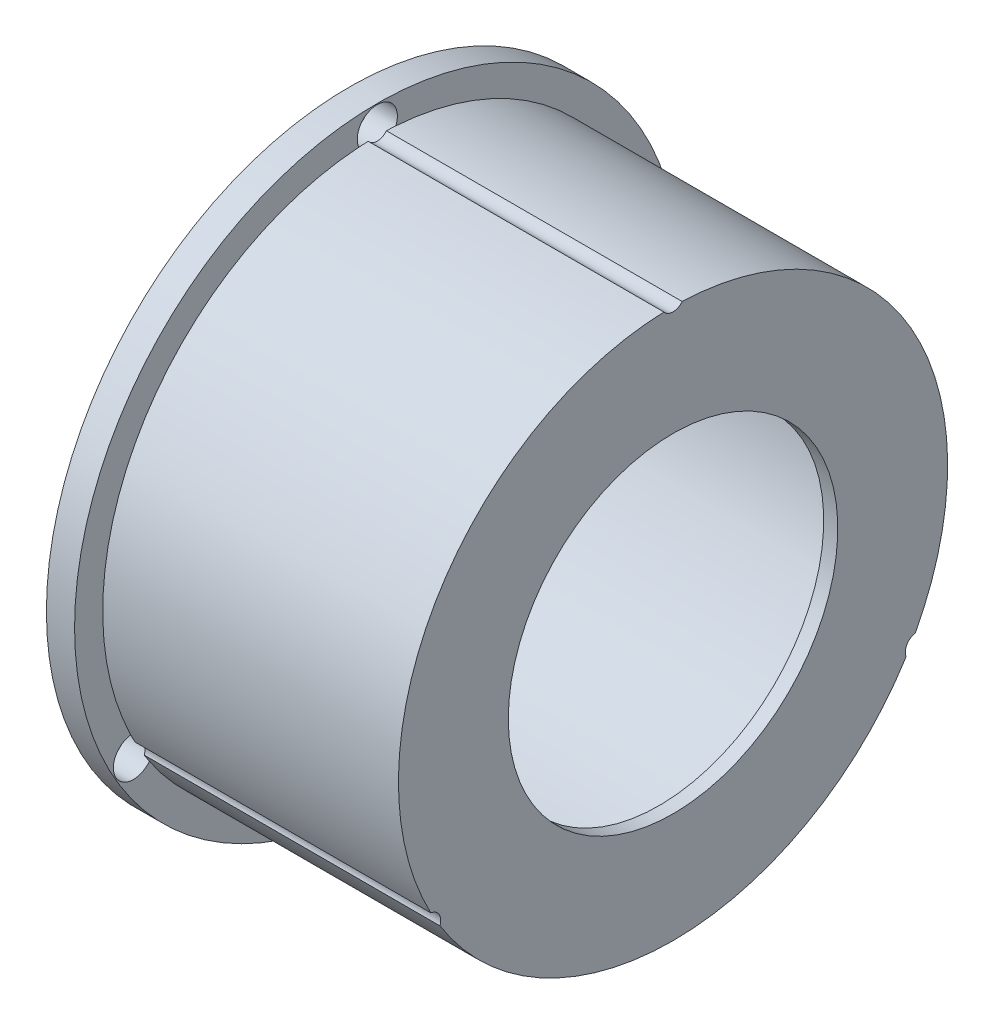
ISO-10303-21;
HEADER;
FILE_DESCRIPTION(('STEP AP214'),'2;1');
FILE_NAME('part.step','',(''),(''),'','','');
FILE_SCHEMA(('AUTOMOTIVE_DESIGN { 1 0 10303 214 1 1 1 1 }'));
ENDSEC;
DATA;
#1=APPLICATION_CONTEXT('core data for automotive mechanical design processes');
#2=APPLICATION_PROTOCOL_DEFINITION('international standard','automotive_design',2000,#1);
#3=PRODUCT_CONTEXT('',#1,'mechanical');
#4=PRODUCT('Part','Part','',(#3));
#5=PRODUCT_RELATED_PRODUCT_CATEGORY('part','',(#4));
#6=PRODUCT_DEFINITION_FORMATION('','',#4);
#7=PRODUCT_DEFINITION_CONTEXT('part definition',#1,'design');
#8=PRODUCT_DEFINITION('design','',#6,#7);
#9=PRODUCT_DEFINITION_SHAPE('','',#8);
#10=(LENGTH_UNIT() NAMED_UNIT(*) SI_UNIT(.MILLI.,.METRE.));
#11=(NAMED_UNIT(*) PLANE_ANGLE_UNIT() SI_UNIT($,.RADIAN.));
#12=(NAMED_UNIT(*) SI_UNIT($,.STERADIAN.) SOLID_ANGLE_UNIT());
#13=UNCERTAINTY_MEASURE_WITH_UNIT(LENGTH_MEASURE(1.E-05),#10,'distance_accuracy_value','');
#14=(GEOMETRIC_REPRESENTATION_CONTEXT(3) GLOBAL_UNCERTAINTY_ASSIGNED_CONTEXT((#13)) GLOBAL_UNIT_ASSIGNED_CONTEXT((#10,
#11,#12)) REPRESENTATION_CONTEXT('',''));
#15=CARTESIAN_POINT('',(0.,0.,0.));
#16=DIRECTION('',(0.,0.,1.));
#17=DIRECTION('',(1.,0.,0.));
#18=AXIS2_PLACEMENT_3D('',#15,#16,#17);
#19=CARTESIAN_POINT('',(-110.,0.,0.));
#20=DIRECTION('',(-1.,0.,0.));
#21=DIRECTION('',(0.,0.,1.));
#22=AXIS2_PLACEMENT_3D('',#19,#20,#21);
#23=CYLINDRICAL_SURFACE('',#22,39.);
#24=DIRECTION('',(-1.,0.,0.));
#25=VECTOR('',#24,1.);
#26=CARTESIAN_POINT('',(90.85,38.9784687500001,-1.29575225458943));
#27=LINE('',#26,#25);
#28=CARTESIAN_POINT('',(181.7,38.97846875,-1.29575225458937));
#29=VERTEX_POINT('',#28);
#30=CARTESIAN_POINT('',(139.7,38.97846875,-1.2957522545894));
#31=VERTEX_POINT('',#30);
#32=EDGE_CURVE('E215',#29,#31,#27,.T.);
#33=ORIENTED_EDGE('',*,*,#32,.F.);
#34=CARTESIAN_POINT('',(181.7,0.,0.));
#35=DIRECTION('',(-1.,0.,0.));
#36=DIRECTION('',(0.,0.,1.));
#37=AXIS2_PLACEMENT_3D('',#34,#35,#36);
#38=CIRCLE('',#37,39.);
#39=CARTESIAN_POINT('',(181.7,-18.3670800055147,-34.4042202654125));
#40=VERTEX_POINT('',#39);
#41=EDGE_CURVE('E166',#29,#40,#38,.T.);
#42=ORIENTED_EDGE('',*,*,#41,.T.);
#43=DIRECTION('',(-1.,0.,0.));
#44=VECTOR('',#43,1.);
#45=CARTESIAN_POINT('',(90.85,-18.3670800055146,-34.4042202654126));
#46=LINE('',#45,#44);
#47=CARTESIAN_POINT('',(139.7,-18.3670800055145,-34.4042202654126));
#48=VERTEX_POINT('',#47);
#49=EDGE_CURVE('E264',#48,#40,#46,.F.);
#50=ORIENTED_EDGE('',*,*,#49,.F.);
#51=CARTESIAN_POINT('',(139.7,0.,0.));
#52=DIRECTION('',(1.,0.,0.));
#53=DIRECTION('',(0.,0.,-1.));
#54=AXIS2_PLACEMENT_3D('',#51,#52,#53);
#55=CIRCLE('',#54,39.);
#56=CARTESIAN_POINT('',(139.7,-17.1746110329679,-35.0147502613721));
#57=VERTEX_POINT('',#56);
#58=EDGE_CURVE('E266',#48,#57,#55,.T.);
#59=ORIENTED_EDGE('',*,*,#58,.T.);
#60=CARTESIAN_POINT('',(139.7,0.,0.));
#61=DIRECTION('',(-1.,0.,0.));
#62=DIRECTION('',(0.,0.,1.));
#63=AXIS2_PLACEMENT_3D('',#60,#61,#62);
#64=CIRCLE('',#63,39.);
#65=CARTESIAN_POINT('',(139.7,38.91096875,-2.63372567601933));
#66=VERTEX_POINT('',#65);
#67=EDGE_CURVE('E157',#66,#57,#64,.T.);
#68=ORIENTED_EDGE('',*,*,#67,.F.);
#69=EDGE_CURVE('E125',#31,#66,#64,.T.);
#70=ORIENTED_EDGE('',*,*,#69,.F.);
#71=EDGE_LOOP('',(#33,#42,#50,#59,#68,#70));
#72=FACE_BOUND('',#71,.T.);
#73=ADVANCED_FACE('F39',(#72),#23,.T.);
#74=DIRECTION('',(-1.,0.,0.));
#75=VECTOR('',#74,1.);
#76=CARTESIAN_POINT('',(90.85,38.9784687500001,1.29575225458943));
#77=LINE('',#76,#75);
#78=CARTESIAN_POINT('',(139.7,38.97846875,1.29575225458954));
#79=VERTEX_POINT('',#78);
#80=CARTESIAN_POINT('',(181.7,38.97846875,1.29575225458937));
#81=VERTEX_POINT('',#80);
#82=EDGE_CURVE('E134',#79,#81,#77,.F.);
#83=ORIENTED_EDGE('',*,*,#82,.F.);
#84=CARTESIAN_POINT('',(139.7,0.,0.));
#85=DIRECTION('',(1.,0.,0.));
#86=DIRECTION('',(0.,0.,-1.));
#87=AXIS2_PLACEMENT_3D('',#84,#85,#86);
#88=CIRCLE('',#87,39.);
#89=CARTESIAN_POINT('',(139.7,38.91096875,2.63372567601933));
#90=VERTEX_POINT('',#89);
#91=EDGE_CURVE('E55',#79,#90,#88,.T.);
#92=ORIENTED_EDGE('',*,*,#91,.T.);
#93=CARTESIAN_POINT('',(139.7,-17.1746110329679,35.0147502613721));
#94=VERTEX_POINT('',#93);
#95=EDGE_CURVE('E132',#94,#90,#64,.T.);
#96=ORIENTED_EDGE('',*,*,#95,.F.);
#97=CARTESIAN_POINT('',(139.7,-18.3670800055146,34.4042202654126));
#98=VERTEX_POINT('',#97);
#99=EDGE_CURVE('E145',#98,#94,#64,.T.);
#100=ORIENTED_EDGE('',*,*,#99,.F.);
#101=DIRECTION('',(-1.,0.,0.));
#102=VECTOR('',#101,1.);
#103=CARTESIAN_POINT('',(90.85,-18.3670800055146,34.4042202654127));
#104=LINE('',#103,#102);
#105=CARTESIAN_POINT('',(181.7,-18.3670800055146,34.4042202654126));
#106=VERTEX_POINT('',#105);
#107=EDGE_CURVE('E206',#106,#98,#104,.T.);
#108=ORIENTED_EDGE('',*,*,#107,.F.);
#109=EDGE_CURVE('E163',#106,#81,#38,.T.);
#110=ORIENTED_EDGE('',*,*,#109,.T.);
#111=EDGE_LOOP('',(#83,#92,#96,#100,#108,#110));
#112=FACE_BOUND('',#111,.T.);
#113=ADVANCED_FACE('F130',(#112),#23,.T.);
#114=DIRECTION('',(-1.,0.,0.));
#115=VECTOR('',#114,1.);
#116=CARTESIAN_POINT('',(90.85,-20.6113887444854,33.1084680108232));
#117=LINE('',#116,#115);
#118=CARTESIAN_POINT('',(139.7,-20.6113887444855,33.1084680108231));
#119=VERTEX_POINT('',#118);
#120=CARTESIAN_POINT('',(181.7,-20.6113887444853,33.1084680108232));
#121=VERTEX_POINT('',#120);
#122=EDGE_CURVE('E211',#119,#121,#117,.F.);
#123=ORIENTED_EDGE('',*,*,#122,.F.);
#124=CARTESIAN_POINT('',(139.7,0.,0.));
#125=DIRECTION('',(1.,0.,0.));
#126=DIRECTION('',(0.,0.,-1.));
#127=AXIS2_PLACEMENT_3D('',#124,#125,#126);
#128=CIRCLE('',#127,39.);
#129=CARTESIAN_POINT('',(139.7,-21.7363577170321,32.3810245853528));
#130=VERTEX_POINT('',#129);
#131=EDGE_CURVE('E136',#119,#130,#128,.T.);
#132=ORIENTED_EDGE('',*,*,#131,.T.);
#133=CARTESIAN_POINT('',(139.7,-21.7363577170321,-32.3810245853528));
#134=VERTEX_POINT('',#133);
#135=EDGE_CURVE('E148',#134,#130,#64,.T.);
#136=ORIENTED_EDGE('',*,*,#135,.F.);
#137=CARTESIAN_POINT('',(139.7,-20.6113887444854,-33.1084680108232));
#138=VERTEX_POINT('',#137);
#139=EDGE_CURVE('E156',#138,#134,#64,.T.);
#140=ORIENTED_EDGE('',*,*,#139,.F.);
#141=DIRECTION('',(-1.,0.,0.));
#142=VECTOR('',#141,1.);
#143=CARTESIAN_POINT('',(90.85,-20.6113887444855,-33.1084680108232));
#144=LINE('',#143,#142);
#145=CARTESIAN_POINT('',(181.7,-20.6113887444854,-33.1084680108232));
#146=VERTEX_POINT('',#145);
#147=EDGE_CURVE('E217',#146,#138,#144,.T.);
#148=ORIENTED_EDGE('',*,*,#147,.F.);
#149=EDGE_CURVE('E165',#146,#121,#38,.T.);
#150=ORIENTED_EDGE('',*,*,#149,.T.);
#151=EDGE_LOOP('',(#123,#132,#136,#140,#148,#150));
#152=FACE_BOUND('',#151,.T.);
#153=ADVANCED_FACE('F245',(#152),#23,.T.);
#154=CARTESIAN_POINT('',(135.7,43.,0.));
#155=DIRECTION('',(1.,0.,0.));
#156=DIRECTION('',(0.,0.,-1.));
#157=AXIS2_PLACEMENT_3D('',#154,#155,#156);
#158=PLANE('',#157);
#159=CARTESIAN_POINT('',(135.7,40.,0.));
#160=DIRECTION('',(1.,0.,0.));
#161=DIRECTION('',(0.,0.,-1.));
#162=AXIS2_PLACEMENT_3D('',#159,#160,#161);
#163=CIRCLE('',#162,2.85);
#164=CARTESIAN_POINT('',(135.7,40.,-2.85));
#165=VERTEX_POINT('',#164);
#166=EDGE_CURVE('E121',#165,#165,#163,.T.);
#167=ORIENTED_EDGE('',*,*,#166,.T.);
#168=EDGE_LOOP('',(#167));
#169=FACE_BOUND('',#168,.T.);
#170=CARTESIAN_POINT('',(135.7,-20.,34.6410161513775));
#171=DIRECTION('',(1.,0.,0.));
#172=DIRECTION('',(0.,0.,-1.));
#173=AXIS2_PLACEMENT_3D('',#170,#171,#172);
#174=CIRCLE('',#173,2.85);
#175=CARTESIAN_POINT('',(135.7,-20.,31.7910161513775));
#176=VERTEX_POINT('',#175);
#177=EDGE_CURVE('E287',#176,#176,#174,.T.);
#178=ORIENTED_EDGE('',*,*,#177,.T.);
#179=EDGE_LOOP('',(#178));
#180=FACE_BOUND('',#179,.T.);
#181=CARTESIAN_POINT('',(135.7,-20.,-34.6410161513775));
#182=DIRECTION('',(1.,0.,0.));
#183=DIRECTION('',(0.,0.,-1.));
#184=AXIS2_PLACEMENT_3D('',#181,#182,#183);
#185=CIRCLE('',#184,2.85);
#186=CARTESIAN_POINT('',(135.7,-20.,-37.4910161513775));
#187=VERTEX_POINT('',#186);
#188=EDGE_CURVE('E290',#187,#187,#185,.T.);
#189=ORIENTED_EDGE('',*,*,#188,.T.);
#190=EDGE_LOOP('',(#189));
#191=FACE_BOUND('',#190,.T.);
#192=CARTESIAN_POINT('',(135.7,0.,0.));
#193=DIRECTION('',(-1.,0.,0.));
#194=DIRECTION('',(0.,0.,1.));
#195=AXIS2_PLACEMENT_3D('',#192,#193,#194);
#196=CIRCLE('',#195,36.4);
#197=CARTESIAN_POINT('',(135.7,0.,36.4));
#198=VERTEX_POINT('',#197);
#199=EDGE_CURVE('E191',#198,#198,#196,.T.);
#200=ORIENTED_EDGE('',*,*,#199,.F.);
#201=EDGE_LOOP('',(#200));
#202=FACE_BOUND('',#201,.T.);
#203=CARTESIAN_POINT('',(135.7,0.,0.));
#204=DIRECTION('',(-1.,0.,0.));
#205=DIRECTION('',(0.,0.,1.));
#206=AXIS2_PLACEMENT_3D('',#203,#204,#205);
#207=CIRCLE('',#206,43.);
#208=CARTESIAN_POINT('',(135.7,0.,43.));
#209=VERTEX_POINT('',#208);
#210=EDGE_CURVE('E152',#209,#209,#207,.T.);
#211=ORIENTED_EDGE('',*,*,#210,.T.);
#212=EDGE_LOOP('',(#211));
#213=FACE_BOUND('',#212,.T.);
#214=ADVANCED_FACE('F41',(#169,#180,#191,#202,#213),#158,.F.);
#215=CARTESIAN_POINT('',(-110.,0.,0.));
#216=DIRECTION('',(-1.,0.,0.));
#217=DIRECTION('',(0.,0.,1.));
#218=AXIS2_PLACEMENT_3D('',#215,#216,#217);
#219=CYLINDRICAL_SURFACE('',#218,36.4);
#220=CARTESIAN_POINT('',(179.7,0.,0.));
#221=DIRECTION('',(-1.,0.,0.));
#222=DIRECTION('',(0.,0.,1.));
#223=AXIS2_PLACEMENT_3D('',#220,#221,#222);
#224=CIRCLE('',#223,36.4);
#225=CARTESIAN_POINT('',(179.7,0.,36.4));
#226=VERTEX_POINT('',#225);
#227=EDGE_CURVE('E185',#226,#226,#224,.T.);
#228=ORIENTED_EDGE('',*,*,#227,.F.);
#229=EDGE_LOOP('',(#228));
#230=FACE_BOUND('',#229,.T.);
#231=ORIENTED_EDGE('',*,*,#199,.T.);
#232=EDGE_LOOP('',(#231));
#233=FACE_BOUND('',#232,.T.);
#234=ADVANCED_FACE('F254',(#230,#233),#219,.F.);
#235=CARTESIAN_POINT('',(179.7,36.4,0.));
#236=DIRECTION('',(1.,0.,0.));
#237=DIRECTION('',(0.,0.,-1.));
#238=AXIS2_PLACEMENT_3D('',#235,#236,#237);
#239=PLANE('',#238);
#240=CARTESIAN_POINT('',(179.7,0.,0.));
#241=DIRECTION('',(-1.,0.,0.));
#242=DIRECTION('',(0.,0.,1.));
#243=AXIS2_PLACEMENT_3D('',#240,#241,#242);
#244=CIRCLE('',#243,23.4);
#245=CARTESIAN_POINT('',(179.7,0.,23.4));
#246=VERTEX_POINT('',#245);
#247=EDGE_CURVE('E180',#246,#246,#244,.T.);
#248=ORIENTED_EDGE('',*,*,#247,.F.);
#249=EDGE_LOOP('',(#248));
#250=FACE_BOUND('',#249,.T.);
#251=ORIENTED_EDGE('',*,*,#227,.T.);
#252=EDGE_LOOP('',(#251));
#253=FACE_BOUND('',#252,.T.);
#254=ADVANCED_FACE('F392',(#250,#253),#239,.F.);
#255=CARTESIAN_POINT('',(-110.,0.,0.));
#256=DIRECTION('',(-1.,0.,0.));
#257=DIRECTION('',(0.,0.,1.));
#258=AXIS2_PLACEMENT_3D('',#255,#256,#257);
#259=CYLINDRICAL_SURFACE('',#258,23.4);
#260=CARTESIAN_POINT('',(181.7,0.,0.));
#261=DIRECTION('',(-1.,0.,0.));
#262=DIRECTION('',(0.,0.,1.));
#263=AXIS2_PLACEMENT_3D('',#260,#261,#262);
#264=CIRCLE('',#263,23.4);
#265=CARTESIAN_POINT('',(181.7,0.,23.4));
#266=VERTEX_POINT('',#265);
#267=EDGE_CURVE('E174',#266,#266,#264,.T.);
#268=ORIENTED_EDGE('',*,*,#267,.F.);
#269=EDGE_LOOP('',(#268));
#270=FACE_BOUND('',#269,.T.);
#271=ORIENTED_EDGE('',*,*,#247,.T.);
#272=EDGE_LOOP('',(#271));
#273=FACE_BOUND('',#272,.T.);
#274=ADVANCED_FACE('F240',(#270,#273),#259,.F.);
#275=CARTESIAN_POINT('',(181.7,23.4,0.));
#276=DIRECTION('',(-1.,0.,0.));
#277=DIRECTION('',(0.,0.,1.));
#278=AXIS2_PLACEMENT_3D('',#275,#276,#277);
#279=PLANE('',#278);
#280=CARTESIAN_POINT('',(181.7,40.,0.));
#281=DIRECTION('',(1.,0.,0.));
#282=DIRECTION('',(0.,0.,-1.));
#283=AXIS2_PLACEMENT_3D('',#280,#281,#282);
#284=CIRCLE('',#283,1.65);
#285=EDGE_CURVE('E63',#81,#29,#284,.T.);
#286=ORIENTED_EDGE('',*,*,#285,.F.);
#287=ORIENTED_EDGE('',*,*,#109,.F.);
#288=CARTESIAN_POINT('',(181.7,-20.,34.6410161513775));
#289=DIRECTION('',(1.,0.,0.));
#290=DIRECTION('',(0.,0.,-1.));
#291=AXIS2_PLACEMENT_3D('',#288,#289,#290);
#292=CIRCLE('',#291,1.65);
#293=EDGE_CURVE('E209',#121,#106,#292,.T.);
#294=ORIENTED_EDGE('',*,*,#293,.F.);
#295=ORIENTED_EDGE('',*,*,#149,.F.);
#296=CARTESIAN_POINT('',(181.7,-20.,-34.6410161513775));
#297=DIRECTION('',(1.,0.,0.));
#298=DIRECTION('',(0.,0.,-1.));
#299=AXIS2_PLACEMENT_3D('',#296,#297,#298);
#300=CIRCLE('',#299,1.65);
#301=EDGE_CURVE('E260',#40,#146,#300,.T.);
#302=ORIENTED_EDGE('',*,*,#301,.F.);
#303=ORIENTED_EDGE('',*,*,#41,.F.);
#304=EDGE_LOOP('',(#286,#287,#294,#295,#302,#303));
#305=FACE_BOUND('',#304,.T.);
#306=ORIENTED_EDGE('',*,*,#267,.T.);
#307=EDGE_LOOP('',(#306));
#308=FACE_BOUND('',#307,.T.);
#309=ADVANCED_FACE('F235',(#305,#308),#279,.F.);
#310=CARTESIAN_POINT('',(139.7,39.,0.));
#311=DIRECTION('',(-1.,0.,0.));
#312=DIRECTION('',(0.,0.,1.));
#313=AXIS2_PLACEMENT_3D('',#310,#311,#312);
#314=PLANE('',#313);
#315=CARTESIAN_POINT('',(139.7,40.,0.));
#316=DIRECTION('',(1.,0.,0.));
#317=DIRECTION('',(0.,0.,-1.));
#318=AXIS2_PLACEMENT_3D('',#315,#316,#317);
#319=CIRCLE('',#318,2.85);
#320=EDGE_CURVE('E112',#66,#90,#319,.T.);
#321=ORIENTED_EDGE('',*,*,#320,.F.);
#322=ORIENTED_EDGE('',*,*,#67,.T.);
#323=CARTESIAN_POINT('',(139.7,-20.,-34.6410161513775));
#324=DIRECTION('',(1.,0.,0.));
#325=DIRECTION('',(0.,0.,-1.));
#326=AXIS2_PLACEMENT_3D('',#323,#324,#325);
#327=CIRCLE('',#326,2.85);
#328=EDGE_CURVE('E285',#134,#57,#327,.T.);
#329=ORIENTED_EDGE('',*,*,#328,.F.);
#330=ORIENTED_EDGE('',*,*,#135,.T.);
#331=CARTESIAN_POINT('',(139.7,-20.,34.6410161513775));
#332=DIRECTION('',(1.,0.,0.));
#333=DIRECTION('',(0.,0.,-1.));
#334=AXIS2_PLACEMENT_3D('',#331,#332,#333);
#335=CIRCLE('',#334,2.85);
#336=EDGE_CURVE('E143',#94,#130,#335,.T.);
#337=ORIENTED_EDGE('',*,*,#336,.F.);
#338=ORIENTED_EDGE('',*,*,#95,.T.);
#339=EDGE_LOOP('',(#321,#322,#329,#330,#337,#338));
#340=FACE_BOUND('',#339,.T.);
#341=CARTESIAN_POINT('',(139.7,0.,0.));
#342=DIRECTION('',(-1.,0.,0.));
#343=DIRECTION('',(0.,0.,1.));
#344=AXIS2_PLACEMENT_3D('',#341,#342,#343);
#345=CIRCLE('',#344,43.);
#346=CARTESIAN_POINT('',(139.7,0.,43.));
#347=VERTEX_POINT('',#346);
#348=EDGE_CURVE('E146',#347,#347,#345,.T.);
#349=ORIENTED_EDGE('',*,*,#348,.F.);
#350=EDGE_LOOP('',(#349));
#351=FACE_BOUND('',#350,.T.);
#352=ADVANCED_FACE('F139',(#340,#351),#314,.F.);
#353=CARTESIAN_POINT('',(-110.,0.,0.));
#354=DIRECTION('',(-1.,0.,0.));
#355=DIRECTION('',(0.,0.,1.));
#356=AXIS2_PLACEMENT_3D('',#353,#354,#355);
#357=CYLINDRICAL_SURFACE('',#356,43.);
#358=ORIENTED_EDGE('',*,*,#210,.F.);
#359=EDGE_LOOP('',(#358));
#360=FACE_BOUND('',#359,.T.);
#361=ORIENTED_EDGE('',*,*,#348,.T.);
#362=EDGE_LOOP('',(#361));
#363=FACE_BOUND('',#362,.T.);
#364=ADVANCED_FACE('F228',(#360,#363),#357,.T.);
#365=CARTESIAN_POINT('',(181.7,-20.,-34.6410161513775));
#366=DIRECTION('',(-1.,0.,0.));
#367=DIRECTION('',(0.,0.,1.));
#368=AXIS2_PLACEMENT_3D('',#365,#366,#367);
#369=CYLINDRICAL_SURFACE('',#368,1.65);
#370=CARTESIAN_POINT('',(139.7,-20.,-34.6410161513775));
#371=DIRECTION('',(1.,0.,0.));
#372=DIRECTION('',(0.,0.,-1.));
#373=AXIS2_PLACEMENT_3D('',#370,#371,#372);
#374=CIRCLE('',#373,1.65);
#375=EDGE_CURVE('E11',#48,#138,#374,.T.);
#376=ORIENTED_EDGE('',*,*,#375,.F.);
#377=ORIENTED_EDGE('',*,*,#49,.T.);
#378=ORIENTED_EDGE('',*,*,#301,.T.);
#379=ORIENTED_EDGE('',*,*,#147,.T.);
#380=EDGE_LOOP('',(#376,#377,#378,#379));
#381=FACE_BOUND('',#380,.T.);
#382=ADVANCED_FACE('F231',(#381),#369,.F.);
#383=CARTESIAN_POINT('',(181.7,-20.,34.6410161513775));
#384=DIRECTION('',(-1.,0.,0.));
#385=DIRECTION('',(0.,0.,1.));
#386=AXIS2_PLACEMENT_3D('',#383,#384,#385);
#387=CYLINDRICAL_SURFACE('',#386,1.65);
#388=CARTESIAN_POINT('',(139.7,-20.,34.6410161513775));
#389=DIRECTION('',(1.,0.,0.));
#390=DIRECTION('',(0.,0.,-1.));
#391=AXIS2_PLACEMENT_3D('',#388,#389,#390);
#392=CIRCLE('',#391,1.65);
#393=EDGE_CURVE('E48',#119,#98,#392,.T.);
#394=ORIENTED_EDGE('',*,*,#393,.F.);
#395=ORIENTED_EDGE('',*,*,#122,.T.);
#396=ORIENTED_EDGE('',*,*,#293,.T.);
#397=ORIENTED_EDGE('',*,*,#107,.T.);
#398=EDGE_LOOP('',(#394,#395,#396,#397));
#399=FACE_BOUND('',#398,.T.);
#400=ADVANCED_FACE('F207',(#399),#387,.F.);
#401=CARTESIAN_POINT('',(181.7,40.,0.));
#402=DIRECTION('',(-1.,0.,0.));
#403=DIRECTION('',(0.,0.,1.));
#404=AXIS2_PLACEMENT_3D('',#401,#402,#403);
#405=CYLINDRICAL_SURFACE('',#404,1.65);
#406=CARTESIAN_POINT('',(139.7,40.,0.));
#407=DIRECTION('',(1.,0.,0.));
#408=DIRECTION('',(0.,0.,-1.));
#409=AXIS2_PLACEMENT_3D('',#406,#407,#408);
#410=CIRCLE('',#409,1.65);
#411=EDGE_CURVE('E195',#79,#31,#410,.T.);
#412=ORIENTED_EDGE('',*,*,#411,.F.);
#413=ORIENTED_EDGE('',*,*,#82,.T.);
#414=ORIENTED_EDGE('',*,*,#285,.T.);
#415=ORIENTED_EDGE('',*,*,#32,.T.);
#416=EDGE_LOOP('',(#412,#413,#414,#415));
#417=FACE_BOUND('',#416,.T.);
#418=ADVANCED_FACE('F299',(#417),#405,.F.);
#419=CARTESIAN_POINT('',(139.7,40.,0.));
#420=DIRECTION('',(1.,0.,0.));
#421=DIRECTION('',(0.,0.,-1.));
#422=AXIS2_PLACEMENT_3D('',#419,#420,#421);
#423=PLANE('',#422);
#424=EDGE_CURVE('E115',#90,#66,#319,.T.);
#425=ORIENTED_EDGE('',*,*,#424,.F.);
#426=ORIENTED_EDGE('',*,*,#91,.F.);
#427=ORIENTED_EDGE('',*,*,#411,.T.);
#428=ORIENTED_EDGE('',*,*,#69,.T.);
#429=EDGE_LOOP('',(#425,#426,#427,#428));
#430=FACE_BOUND('',#429,.T.);
#431=ADVANCED_FACE('F123',(#430),#423,.F.);
#432=CARTESIAN_POINT('',(139.7,40.,0.));
#433=DIRECTION('',(-1.,0.,0.));
#434=DIRECTION('',(0.,0.,1.));
#435=AXIS2_PLACEMENT_3D('',#432,#433,#434);
#436=CYLINDRICAL_SURFACE('',#435,2.85);
#437=ORIENTED_EDGE('',*,*,#424,.T.);
#438=ORIENTED_EDGE('',*,*,#320,.T.);
#439=EDGE_LOOP('',(#437,#438));
#440=FACE_BOUND('',#439,.T.);
#441=ORIENTED_EDGE('',*,*,#166,.F.);
#442=EDGE_LOOP('',(#441));
#443=FACE_BOUND('',#442,.T.);
#444=ADVANCED_FACE('F113',(#440,#443),#436,.F.);
#445=CARTESIAN_POINT('',(139.7,-20.,34.6410161513775));
#446=DIRECTION('',(1.,0.,0.));
#447=DIRECTION('',(0.,0.,-1.));
#448=AXIS2_PLACEMENT_3D('',#445,#446,#447);
#449=PLANE('',#448);
#450=EDGE_CURVE('E379',#130,#94,#335,.T.);
#451=ORIENTED_EDGE('',*,*,#450,.F.);
#452=ORIENTED_EDGE('',*,*,#131,.F.);
#453=ORIENTED_EDGE('',*,*,#393,.T.);
#454=ORIENTED_EDGE('',*,*,#99,.T.);
#455=EDGE_LOOP('',(#451,#452,#453,#454));
#456=FACE_BOUND('',#455,.T.);
#457=ADVANCED_FACE('F201',(#456),#449,.F.);
#458=CARTESIAN_POINT('',(139.7,-20.,34.6410161513775));
#459=DIRECTION('',(-1.,0.,0.));
#460=DIRECTION('',(0.,0.,1.));
#461=AXIS2_PLACEMENT_3D('',#458,#459,#460);
#462=CYLINDRICAL_SURFACE('',#461,2.85);
#463=ORIENTED_EDGE('',*,*,#336,.T.);
#464=ORIENTED_EDGE('',*,*,#450,.T.);
#465=EDGE_LOOP('',(#463,#464));
#466=FACE_BOUND('',#465,.T.);
#467=ORIENTED_EDGE('',*,*,#177,.F.);
#468=EDGE_LOOP('',(#467));
#469=FACE_BOUND('',#468,.T.);
#470=ADVANCED_FACE('F347',(#466,#469),#462,.F.);
#471=CARTESIAN_POINT('',(139.7,-20.,-34.6410161513775));
#472=DIRECTION('',(1.,0.,0.));
#473=DIRECTION('',(0.,0.,-1.));
#474=AXIS2_PLACEMENT_3D('',#471,#472,#473);
#475=PLANE('',#474);
#476=ORIENTED_EDGE('',*,*,#375,.T.);
#477=ORIENTED_EDGE('',*,*,#139,.T.);
#478=EDGE_CURVE('E280',#57,#134,#327,.T.);
#479=ORIENTED_EDGE('',*,*,#478,.F.);
#480=ORIENTED_EDGE('',*,*,#58,.F.);
#481=EDGE_LOOP('',(#476,#477,#479,#480));
#482=FACE_BOUND('',#481,.T.);
#483=ADVANCED_FACE('F279',(#482),#475,.F.);
#484=CARTESIAN_POINT('',(139.7,-20.,-34.6410161513775));
#485=DIRECTION('',(-1.,0.,0.));
#486=DIRECTION('',(0.,0.,1.));
#487=AXIS2_PLACEMENT_3D('',#484,#485,#486);
#488=CYLINDRICAL_SURFACE('',#487,2.85);
#489=ORIENTED_EDGE('',*,*,#478,.T.);
#490=ORIENTED_EDGE('',*,*,#328,.T.);
#491=EDGE_LOOP('',(#489,#490));
#492=FACE_BOUND('',#491,.T.);
#493=ORIENTED_EDGE('',*,*,#188,.F.);
#494=EDGE_LOOP('',(#493));
#495=FACE_BOUND('',#494,.T.);
#496=ADVANCED_FACE('F283',(#492,#495),#488,.F.);
#497=CLOSED_SHELL('',(#73,#113,#153,#214,#234,#254,#274,#309,#352,#364,#382,#400,#418,#431,#444,
#457,#470,#483,#496));
#498=MANIFOLD_SOLID_BREP('B2',#497);
#499=ADVANCED_BREP_SHAPE_REPRESENTATION('',(#18,#498),#14);
#500=SHAPE_DEFINITION_REPRESENTATION(#9,#499);
ENDSEC;
END-ISO-10303-21;
